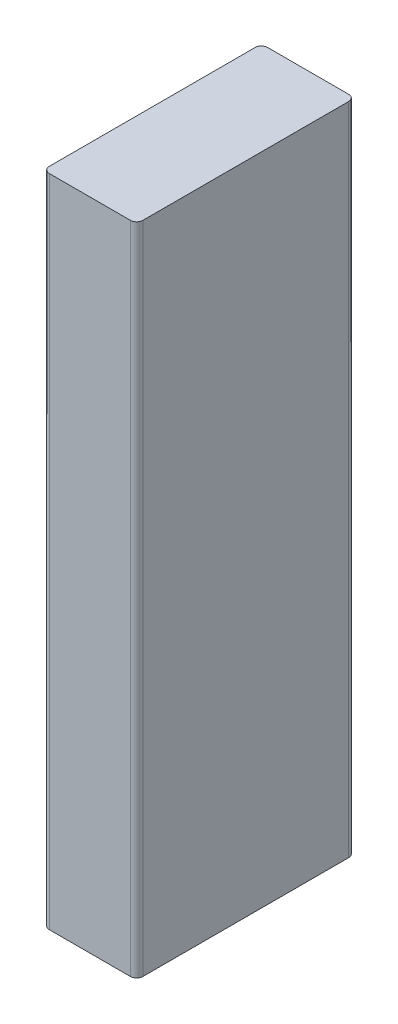
ISO-10303-21;
HEADER;
FILE_DESCRIPTION(('STEP AP214'),'2;1');
FILE_NAME('part.step','',(''),(''),'','','');
FILE_SCHEMA(('AUTOMOTIVE_DESIGN { 1 0 10303 214 1 1 1 1 }'));
ENDSEC;
DATA;
#1=APPLICATION_CONTEXT('core data for automotive mechanical design processes');
#2=APPLICATION_PROTOCOL_DEFINITION('international standard','automotive_design',2000,#1);
#3=PRODUCT_CONTEXT('',#1,'mechanical');
#4=PRODUCT('Part','Part','',(#3));
#5=PRODUCT_RELATED_PRODUCT_CATEGORY('part','',(#4));
#6=PRODUCT_DEFINITION_FORMATION('','',#4);
#7=PRODUCT_DEFINITION_CONTEXT('part definition',#1,'design');
#8=PRODUCT_DEFINITION('design','',#6,#7);
#9=PRODUCT_DEFINITION_SHAPE('','',#8);
#10=(LENGTH_UNIT() NAMED_UNIT(*) SI_UNIT(.MILLI.,.METRE.));
#11=(NAMED_UNIT(*) PLANE_ANGLE_UNIT() SI_UNIT($,.RADIAN.));
#12=(NAMED_UNIT(*) SI_UNIT($,.STERADIAN.) SOLID_ANGLE_UNIT());
#13=UNCERTAINTY_MEASURE_WITH_UNIT(LENGTH_MEASURE(1.E-05),#10,'distance_accuracy_value','');
#14=(GEOMETRIC_REPRESENTATION_CONTEXT(3) GLOBAL_UNCERTAINTY_ASSIGNED_CONTEXT((#13)) GLOBAL_UNIT_ASSIGNED_CONTEXT((#10,
#11,#12)) REPRESENTATION_CONTEXT('',''));
#15=CARTESIAN_POINT('',(0.,0.,0.));
#16=DIRECTION('',(0.,0.,1.));
#17=DIRECTION('',(1.,0.,0.));
#18=AXIS2_PLACEMENT_3D('',#15,#16,#17);
#19=CARTESIAN_POINT('',(19.05,266.7,44.45));
#20=DIRECTION('',(-1.,0.,0.));
#21=DIRECTION('',(0.,0.,1.));
#22=AXIS2_PLACEMENT_3D('',#19,#20,#21);
#23=PLANE('',#22);
#24=DIRECTION('',(0.,0.,-1.));
#25=VECTOR('',#24,1.);
#26=CARTESIAN_POINT('',(19.05,0.,44.45));
#27=LINE('',#26,#25);
#28=CARTESIAN_POINT('',(19.05,0.,41.91));
#29=VERTEX_POINT('',#28);
#30=CARTESIAN_POINT('',(19.05,0.,-41.91));
#31=VERTEX_POINT('',#30);
#32=EDGE_CURVE('E133',#29,#31,#27,.T.);
#33=ORIENTED_EDGE('',*,*,#32,.T.);
#34=DIRECTION('',(0.,-1.,0.));
#35=VECTOR('',#34,1.);
#36=CARTESIAN_POINT('',(19.05,266.7,-41.91));
#37=LINE('',#36,#35);
#38=CARTESIAN_POINT('',(19.05,266.7,-41.91));
#39=VERTEX_POINT('',#38);
#40=EDGE_CURVE('E155',#31,#39,#37,.F.);
#41=ORIENTED_EDGE('',*,*,#40,.T.);
#42=DIRECTION('',(0.,0.,-1.));
#43=VECTOR('',#42,1.);
#44=CARTESIAN_POINT('',(19.05,266.7,44.45));
#45=LINE('',#44,#43);
#46=CARTESIAN_POINT('',(19.05,266.7,41.91));
#47=VERTEX_POINT('',#46);
#48=EDGE_CURVE('E131',#47,#39,#45,.T.);
#49=ORIENTED_EDGE('',*,*,#48,.F.);
#50=DIRECTION('',(0.,-1.,0.));
#51=VECTOR('',#50,1.);
#52=CARTESIAN_POINT('',(19.05,266.7,41.91));
#53=LINE('',#52,#51);
#54=EDGE_CURVE('E152',#47,#29,#53,.T.);
#55=ORIENTED_EDGE('',*,*,#54,.T.);
#56=EDGE_LOOP('',(#33,#41,#49,#55));
#57=FACE_BOUND('',#56,.T.);
#58=ADVANCED_FACE('F36',(#57),#23,.F.);
#59=CARTESIAN_POINT('',(-19.05,266.7,-44.45));
#60=DIRECTION('',(0.,0.,1.));
#61=DIRECTION('',(1.,0.,0.));
#62=AXIS2_PLACEMENT_3D('',#59,#60,#61);
#63=PLANE('',#62);
#64=DIRECTION('',(-1.,0.,0.));
#65=VECTOR('',#64,1.);
#66=CARTESIAN_POINT('',(-19.05,0.,-44.45));
#67=LINE('',#66,#65);
#68=CARTESIAN_POINT('',(16.51,0.,-44.45));
#69=VERTEX_POINT('',#68);
#70=CARTESIAN_POINT('',(-16.51,0.,-44.45));
#71=VERTEX_POINT('',#70);
#72=EDGE_CURVE('E129',#69,#71,#67,.T.);
#73=ORIENTED_EDGE('',*,*,#72,.T.);
#74=DIRECTION('',(0.,-1.,0.));
#75=VECTOR('',#74,1.);
#76=CARTESIAN_POINT('',(-16.51,266.7,-44.45));
#77=LINE('',#76,#75);
#78=CARTESIAN_POINT('',(-16.51,266.7,-44.45));
#79=VERTEX_POINT('',#78);
#80=EDGE_CURVE('E107',#71,#79,#77,.F.);
#81=ORIENTED_EDGE('',*,*,#80,.T.);
#82=DIRECTION('',(-1.,0.,0.));
#83=VECTOR('',#82,1.);
#84=CARTESIAN_POINT('',(-19.05,266.7,-44.45));
#85=LINE('',#84,#83);
#86=CARTESIAN_POINT('',(16.51,266.7,-44.45));
#87=VERTEX_POINT('',#86);
#88=EDGE_CURVE('E169',#87,#79,#85,.T.);
#89=ORIENTED_EDGE('',*,*,#88,.F.);
#90=DIRECTION('',(0.,-1.,0.));
#91=VECTOR('',#90,1.);
#92=CARTESIAN_POINT('',(16.51,266.7,-44.45));
#93=LINE('',#92,#91);
#94=EDGE_CURVE('E112',#87,#69,#93,.T.);
#95=ORIENTED_EDGE('',*,*,#94,.T.);
#96=EDGE_LOOP('',(#73,#81,#89,#95));
#97=FACE_BOUND('',#96,.T.);
#98=ADVANCED_FACE('F174',(#97),#63,.F.);
#99=CARTESIAN_POINT('',(-19.05,266.7,44.45));
#100=DIRECTION('',(1.,0.,0.));
#101=DIRECTION('',(0.,0.,-1.));
#102=AXIS2_PLACEMENT_3D('',#99,#100,#101);
#103=PLANE('',#102);
#104=DIRECTION('',(0.,0.,1.));
#105=VECTOR('',#104,1.);
#106=CARTESIAN_POINT('',(-19.05,266.7,44.45));
#107=LINE('',#106,#105);
#108=CARTESIAN_POINT('',(-19.05,266.7,-41.91));
#109=VERTEX_POINT('',#108);
#110=CARTESIAN_POINT('',(-19.05,266.7,41.91));
#111=VERTEX_POINT('',#110);
#112=EDGE_CURVE('E121',#109,#111,#107,.T.);
#113=ORIENTED_EDGE('',*,*,#112,.F.);
#114=DIRECTION('',(0.,-1.,0.));
#115=VECTOR('',#114,1.);
#116=CARTESIAN_POINT('',(-19.05,266.7,-41.91));
#117=LINE('',#116,#115);
#118=CARTESIAN_POINT('',(-19.05,0.,-41.91));
#119=VERTEX_POINT('',#118);
#120=EDGE_CURVE('E106',#109,#119,#117,.T.);
#121=ORIENTED_EDGE('',*,*,#120,.T.);
#122=DIRECTION('',(0.,0.,1.));
#123=VECTOR('',#122,1.);
#124=CARTESIAN_POINT('',(-19.05,0.,44.45));
#125=LINE('',#124,#123);
#126=CARTESIAN_POINT('',(-19.05,0.,41.91));
#127=VERTEX_POINT('',#126);
#128=EDGE_CURVE('E119',#119,#127,#125,.T.);
#129=ORIENTED_EDGE('',*,*,#128,.T.);
#130=DIRECTION('',(0.,-1.,0.));
#131=VECTOR('',#130,1.);
#132=CARTESIAN_POINT('',(-19.05,266.7,41.91));
#133=LINE('',#132,#131);
#134=EDGE_CURVE('E123',#127,#111,#133,.F.);
#135=ORIENTED_EDGE('',*,*,#134,.T.);
#136=EDGE_LOOP('',(#113,#121,#129,#135));
#137=FACE_BOUND('',#136,.T.);
#138=ADVANCED_FACE('F118',(#137),#103,.F.);
#139=CARTESIAN_POINT('',(-19.05,266.7,44.45));
#140=DIRECTION('',(0.,0.,-1.));
#141=DIRECTION('',(-1.,0.,0.));
#142=AXIS2_PLACEMENT_3D('',#139,#140,#141);
#143=PLANE('',#142);
#144=DIRECTION('',(1.,0.,0.));
#145=VECTOR('',#144,1.);
#146=CARTESIAN_POINT('',(-19.05,266.7,44.45));
#147=LINE('',#146,#145);
#148=CARTESIAN_POINT('',(-16.51,266.7,44.45));
#149=VERTEX_POINT('',#148);
#150=CARTESIAN_POINT('',(16.51,266.7,44.45));
#151=VERTEX_POINT('',#150);
#152=EDGE_CURVE('E137',#149,#151,#147,.T.);
#153=ORIENTED_EDGE('',*,*,#152,.F.);
#154=DIRECTION('',(0.,-1.,0.));
#155=VECTOR('',#154,1.);
#156=CARTESIAN_POINT('',(-16.51,266.7,44.45));
#157=LINE('',#156,#155);
#158=CARTESIAN_POINT('',(-16.51,0.,44.45));
#159=VERTEX_POINT('',#158);
#160=EDGE_CURVE('E11',#149,#159,#157,.T.);
#161=ORIENTED_EDGE('',*,*,#160,.T.);
#162=DIRECTION('',(1.,0.,0.));
#163=VECTOR('',#162,1.);
#164=CARTESIAN_POINT('',(-19.05,0.,44.45));
#165=LINE('',#164,#163);
#166=CARTESIAN_POINT('',(16.51,0.,44.45));
#167=VERTEX_POINT('',#166);
#168=EDGE_CURVE('E128',#159,#167,#165,.T.);
#169=ORIENTED_EDGE('',*,*,#168,.T.);
#170=DIRECTION('',(0.,-1.,0.));
#171=VECTOR('',#170,1.);
#172=CARTESIAN_POINT('',(16.51,266.7,44.45));
#173=LINE('',#172,#171);
#174=EDGE_CURVE('E44',#167,#151,#173,.F.);
#175=ORIENTED_EDGE('',*,*,#174,.T.);
#176=EDGE_LOOP('',(#153,#161,#169,#175));
#177=FACE_BOUND('',#176,.T.);
#178=ADVANCED_FACE('F181',(#177),#143,.F.);
#179=CARTESIAN_POINT('',(0.,266.7,0.));
#180=DIRECTION('',(0.,-1.,0.));
#181=DIRECTION('',(0.,0.,-1.));
#182=AXIS2_PLACEMENT_3D('',#179,#180,#181);
#183=PLANE('',#182);
#184=ORIENTED_EDGE('',*,*,#88,.T.);
#185=CARTESIAN_POINT('',(-16.51,266.7,-41.91));
#186=DIRECTION('',(0.,-1.,0.));
#187=DIRECTION('',(0.,0.,-1.));
#188=AXIS2_PLACEMENT_3D('',#185,#186,#187);
#189=CIRCLE('',#188,2.54);
#190=EDGE_CURVE('E150',#79,#109,#189,.F.);
#191=ORIENTED_EDGE('',*,*,#190,.T.);
#192=ORIENTED_EDGE('',*,*,#112,.T.);
#193=CARTESIAN_POINT('',(-16.51,266.7,41.91));
#194=DIRECTION('',(0.,-1.,0.));
#195=DIRECTION('',(0.,0.,-1.));
#196=AXIS2_PLACEMENT_3D('',#193,#194,#195);
#197=CIRCLE('',#196,2.54);
#198=EDGE_CURVE('E57',#111,#149,#197,.F.);
#199=ORIENTED_EDGE('',*,*,#198,.T.);
#200=ORIENTED_EDGE('',*,*,#152,.T.);
#201=CARTESIAN_POINT('',(16.51,266.7,41.91));
#202=DIRECTION('',(0.,-1.,0.));
#203=DIRECTION('',(0.,0.,-1.));
#204=AXIS2_PLACEMENT_3D('',#201,#202,#203);
#205=CIRCLE('',#204,2.54);
#206=EDGE_CURVE('E145',#151,#47,#205,.F.);
#207=ORIENTED_EDGE('',*,*,#206,.T.);
#208=ORIENTED_EDGE('',*,*,#48,.T.);
#209=CARTESIAN_POINT('',(16.51,266.7,-41.91));
#210=DIRECTION('',(0.,-1.,0.));
#211=DIRECTION('',(0.,0.,-1.));
#212=AXIS2_PLACEMENT_3D('',#209,#210,#211);
#213=CIRCLE('',#212,2.54);
#214=EDGE_CURVE('E148',#39,#87,#213,.F.);
#215=ORIENTED_EDGE('',*,*,#214,.T.);
#216=EDGE_LOOP('',(#184,#191,#192,#199,#200,#207,#208,#215));
#217=FACE_BOUND('',#216,.T.);
#218=ADVANCED_FACE('F166',(#217),#183,.F.);
#219=CARTESIAN_POINT('',(0.,0.,0.));
#220=DIRECTION('',(0.,-1.,0.));
#221=DIRECTION('',(0.,0.,-1.));
#222=AXIS2_PLACEMENT_3D('',#219,#220,#221);
#223=PLANE('',#222);
#224=ORIENTED_EDGE('',*,*,#128,.F.);
#225=CARTESIAN_POINT('',(-16.51,0.,-41.91));
#226=DIRECTION('',(0.,-1.,0.));
#227=DIRECTION('',(0.,0.,-1.));
#228=AXIS2_PLACEMENT_3D('',#225,#226,#227);
#229=CIRCLE('',#228,2.54);
#230=EDGE_CURVE('E102',#119,#71,#229,.T.);
#231=ORIENTED_EDGE('',*,*,#230,.T.);
#232=ORIENTED_EDGE('',*,*,#72,.F.);
#233=CARTESIAN_POINT('',(16.51,0.,-41.91));
#234=DIRECTION('',(0.,-1.,0.));
#235=DIRECTION('',(0.,0.,-1.));
#236=AXIS2_PLACEMENT_3D('',#233,#234,#235);
#237=CIRCLE('',#236,2.54);
#238=EDGE_CURVE('E113',#69,#31,#237,.T.);
#239=ORIENTED_EDGE('',*,*,#238,.T.);
#240=ORIENTED_EDGE('',*,*,#32,.F.);
#241=CARTESIAN_POINT('',(16.51,0.,41.91));
#242=DIRECTION('',(0.,-1.,0.));
#243=DIRECTION('',(0.,0.,-1.));
#244=AXIS2_PLACEMENT_3D('',#241,#242,#243);
#245=CIRCLE('',#244,2.54);
#246=EDGE_CURVE('E122',#29,#167,#245,.T.);
#247=ORIENTED_EDGE('',*,*,#246,.T.);
#248=ORIENTED_EDGE('',*,*,#168,.F.);
#249=CARTESIAN_POINT('',(-16.51,0.,41.91));
#250=DIRECTION('',(0.,-1.,0.));
#251=DIRECTION('',(0.,0.,-1.));
#252=AXIS2_PLACEMENT_3D('',#249,#250,#251);
#253=CIRCLE('',#252,2.54);
#254=EDGE_CURVE('E127',#159,#127,#253,.T.);
#255=ORIENTED_EDGE('',*,*,#254,.T.);
#256=EDGE_LOOP('',(#224,#231,#232,#239,#240,#247,#248,#255));
#257=FACE_BOUND('',#256,.T.);
#258=ADVANCED_FACE('F125',(#257),#223,.T.);
#259=CARTESIAN_POINT('',(-16.51,266.7,-41.91));
#260=DIRECTION('',(0.,-1.,0.));
#261=DIRECTION('',(0.,0.,-1.));
#262=AXIS2_PLACEMENT_3D('',#259,#260,#261);
#263=CYLINDRICAL_SURFACE('',#262,2.54);
#264=ORIENTED_EDGE('',*,*,#190,.F.);
#265=ORIENTED_EDGE('',*,*,#80,.F.);
#266=ORIENTED_EDGE('',*,*,#230,.F.);
#267=ORIENTED_EDGE('',*,*,#120,.F.);
#268=EDGE_LOOP('',(#264,#265,#266,#267));
#269=FACE_BOUND('',#268,.T.);
#270=ADVANCED_FACE('F105',(#269),#263,.T.);
#271=CARTESIAN_POINT('',(16.51,266.7,-41.91));
#272=DIRECTION('',(0.,-1.,0.));
#273=DIRECTION('',(0.,0.,-1.));
#274=AXIS2_PLACEMENT_3D('',#271,#272,#273);
#275=CYLINDRICAL_SURFACE('',#274,2.54);
#276=ORIENTED_EDGE('',*,*,#214,.F.);
#277=ORIENTED_EDGE('',*,*,#40,.F.);
#278=ORIENTED_EDGE('',*,*,#238,.F.);
#279=ORIENTED_EDGE('',*,*,#94,.F.);
#280=EDGE_LOOP('',(#276,#277,#278,#279));
#281=FACE_BOUND('',#280,.T.);
#282=ADVANCED_FACE('F172',(#281),#275,.T.);
#283=CARTESIAN_POINT('',(-16.51,266.7,41.91));
#284=DIRECTION('',(0.,-1.,0.));
#285=DIRECTION('',(0.,0.,-1.));
#286=AXIS2_PLACEMENT_3D('',#283,#284,#285);
#287=CYLINDRICAL_SURFACE('',#286,2.54);
#288=ORIENTED_EDGE('',*,*,#198,.F.);
#289=ORIENTED_EDGE('',*,*,#134,.F.);
#290=ORIENTED_EDGE('',*,*,#254,.F.);
#291=ORIENTED_EDGE('',*,*,#160,.F.);
#292=EDGE_LOOP('',(#288,#289,#290,#291));
#293=FACE_BOUND('',#292,.T.);
#294=ADVANCED_FACE('F180',(#293),#287,.T.);
#295=CARTESIAN_POINT('',(16.51,266.7,41.91));
#296=DIRECTION('',(0.,-1.,0.));
#297=DIRECTION('',(0.,0.,-1.));
#298=AXIS2_PLACEMENT_3D('',#295,#296,#297);
#299=CYLINDRICAL_SURFACE('',#298,2.54);
#300=ORIENTED_EDGE('',*,*,#206,.F.);
#301=ORIENTED_EDGE('',*,*,#174,.F.);
#302=ORIENTED_EDGE('',*,*,#246,.F.);
#303=ORIENTED_EDGE('',*,*,#54,.F.);
#304=EDGE_LOOP('',(#300,#301,#302,#303));
#305=FACE_BOUND('',#304,.T.);
#306=ADVANCED_FACE('F38',(#305),#299,.T.);
#307=CLOSED_SHELL('',(#58,#98,#138,#178,#218,#258,#270,#282,#294,#306));
#308=MANIFOLD_SOLID_BREP('B2',#307);
#309=ADVANCED_BREP_SHAPE_REPRESENTATION('',(#18,#308),#14);
#310=SHAPE_DEFINITION_REPRESENTATION(#9,#309);
ENDSEC;
END-ISO-10303-21;
